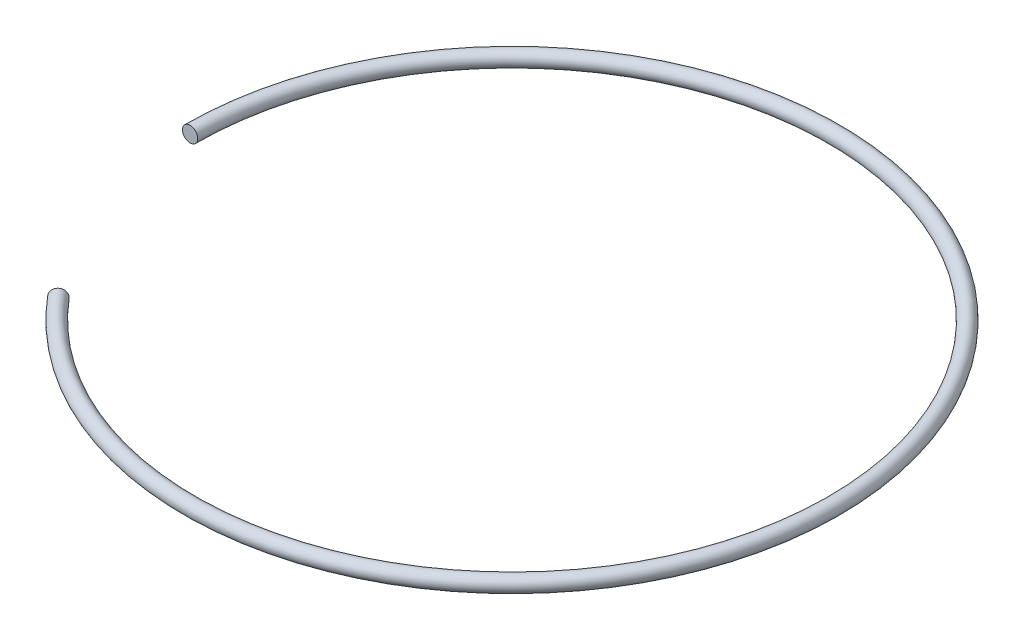
ISO-10303-21;
HEADER;
FILE_DESCRIPTION(('STEP AP214'),'2;1');
FILE_NAME('part.step','',(''),(''),'','','');
FILE_SCHEMA(('AUTOMOTIVE_DESIGN { 1 0 10303 214 1 1 1 1 }'));
ENDSEC;
DATA;
#1=APPLICATION_CONTEXT('core data for automotive mechanical design processes');
#2=APPLICATION_PROTOCOL_DEFINITION('international standard','automotive_design',2000,#1);
#3=PRODUCT_CONTEXT('',#1,'mechanical');
#4=PRODUCT('Part','Part','',(#3));
#5=PRODUCT_RELATED_PRODUCT_CATEGORY('part','',(#4));
#6=PRODUCT_DEFINITION_FORMATION('','',#4);
#7=PRODUCT_DEFINITION_CONTEXT('part definition',#1,'design');
#8=PRODUCT_DEFINITION('design','',#6,#7);
#9=PRODUCT_DEFINITION_SHAPE('','',#8);
#10=(LENGTH_UNIT() NAMED_UNIT(*) SI_UNIT(.MILLI.,.METRE.));
#11=(NAMED_UNIT(*) PLANE_ANGLE_UNIT() SI_UNIT($,.RADIAN.));
#12=(NAMED_UNIT(*) SI_UNIT($,.STERADIAN.) SOLID_ANGLE_UNIT());
#13=UNCERTAINTY_MEASURE_WITH_UNIT(LENGTH_MEASURE(1.E-05),#10,'distance_accuracy_value','');
#14=(GEOMETRIC_REPRESENTATION_CONTEXT(3) GLOBAL_UNCERTAINTY_ASSIGNED_CONTEXT((#13)) GLOBAL_UNIT_ASSIGNED_CONTEXT((#10,
#11,#12)) REPRESENTATION_CONTEXT('',''));
#15=CARTESIAN_POINT('',(0.,0.,0.));
#16=DIRECTION('',(0.,0.,1.));
#17=DIRECTION('',(1.,0.,0.));
#18=AXIS2_PLACEMENT_3D('',#15,#16,#17);
#19=CARTESIAN_POINT('',(0.,5.,0.));
#20=DIRECTION('',(0.,0.,1.));
#21=DIRECTION('',(1.,0.,0.));
#22=AXIS2_PLACEMENT_3D('',#19,#20,#21);
#23=PLANE('',#22);
#24=CARTESIAN_POINT('',(-6.15,0.440000000000001,0.));
#25=CARTESIAN_POINT('',(-6.15001062983499,0.42319249164499,0.));
#26=CARTESIAN_POINT('',(-6.15287538462174,0.406281558710685,0.));
#27=CARTESIAN_POINT('',(-6.16403597751348,0.374416764003044,0.));
#28=CARTESIAN_POINT('',(-6.17233181561848,0.359462902229706,0.));
#29=CARTESIAN_POINT('',(-6.19340700512756,0.333129254032241,0.));
#30=CARTESIAN_POINT('',(-6.20618635653177,0.321749467608205,0.));
#31=CARTESIAN_POINT('',(-6.23479109373738,0.303865334950795,0.));
#32=CARTESIAN_POINT('',(-6.25061647953878,0.297360988717422,0.));
#33=CARTESIAN_POINT('',(-6.28352818642906,0.289956461444852,0.));
#34=CARTESIAN_POINT('',(-6.30061450751794,0.289056280405654,0.));
#35=CARTESIAN_POINT('',(-6.33412206349802,0.292961554634673,0.));
#36=CARTESIAN_POINT('',(-6.35054329838922,0.297767009902889,0.));
#37=CARTESIAN_POINT('',(-6.38086889279606,0.312546438693667,0.));
#38=CARTESIAN_POINT('',(-6.39477325231169,0.322520412216229,0.));
#39=CARTESIAN_POINT('',(-6.41849883134805,0.346493762829983,0.));
#40=CARTESIAN_POINT('',(-6.42832005086878,0.360493139921175,0.));
#41=CARTESIAN_POINT('',(-6.44276711566352,0.391008812850514,0.));
#42=CARTESIAN_POINT('',(-6.44739296093752,0.40752510868866,0.));
#43=CARTESIAN_POINT('',(-6.44972637429642,0.429476017085077,0.));
#44=CARTESIAN_POINT('',(-6.45000333113523,0.434732930161899,0.));
#45=CARTESIAN_POINT('',(-6.44998937016501,0.456807508355013,0.));
#46=CARTESIAN_POINT('',(-6.44712461537826,0.473718441289317,0.));
#47=CARTESIAN_POINT('',(-6.43596402248651,0.505583235996959,0.));
#48=CARTESIAN_POINT('',(-6.42766818438152,0.520537097770296,0.));
#49=CARTESIAN_POINT('',(-6.40659299487243,0.546870745967761,0.));
#50=CARTESIAN_POINT('',(-6.39381364346823,0.558250532391797,0.));
#51=CARTESIAN_POINT('',(-6.36520890626262,0.576134665049207,0.));
#52=CARTESIAN_POINT('',(-6.34938352046122,0.58263901128258,0.));
#53=CARTESIAN_POINT('',(-6.31647181357094,0.590043538555151,0.));
#54=CARTESIAN_POINT('',(-6.29938549248206,0.590943719594348,0.));
#55=CARTESIAN_POINT('',(-6.26587793650198,0.587038445365329,0.));
#56=CARTESIAN_POINT('',(-6.24945670161078,0.582232990097113,0.));
#57=CARTESIAN_POINT('',(-6.21913110720394,0.567453561306336,0.));
#58=CARTESIAN_POINT('',(-6.20522674768831,0.557479587783773,0.));
#59=CARTESIAN_POINT('',(-6.18150116865195,0.533506237170019,0.));
#60=CARTESIAN_POINT('',(-6.17167994913122,0.519506860078827,0.));
#61=CARTESIAN_POINT('',(-6.15723288433648,0.488991187149488,0.));
#62=CARTESIAN_POINT('',(-6.15260703906247,0.472474891311342,0.));
#63=CARTESIAN_POINT('',(-6.15027362570358,0.450523982914926,0.));
#64=CARTESIAN_POINT('',(-6.14999666886477,0.445267069838103,0.));
#65=CARTESIAN_POINT('',(-6.15,0.440000000000001,0.));
#66=B_SPLINE_CURVE_WITH_KNOTS('',3,(#24,#25,#26,#27,#28,#29,#30,#31,#32,#33,#34,#35,#36,#37,#38,
#39,#40,#41,#42,#43,#44,#45,#46,#47,#48,#49,#50,#51,#52,#53,#54,#55,#56,#57,#58,#59,#60,#61,#62,
#63,#64,#65),.UNSPECIFIED.,.T.,.F.,(4,2,2,2,2,2,2,2,2,2,2,2,2,2,2,2,2,2,2,2,4),(0.,
0.0503657057955508,0.100731411591102,0.151097117387924,0.201462823184745,0.251828528981568,
0.302194234778389,0.35255994057521,0.402925646372032,0.453291352168854,0.469074755887429,
0.519440461682979,0.56980616747853,0.620171873275351,0.670537579072173,0.720903284868995,
0.771268990665817,0.821634696462639,0.872000402259462,0.922366108056283,0.938149511774858),.UNSPECIFIED.);
#67=CARTESIAN_POINT('',(-6.15,0.440000000000001,0.));
#68=VERTEX_POINT('',#67);
#69=EDGE_CURVE('E19',#68,#68,#66,.T.);
#70=ORIENTED_EDGE('',*,*,#69,.F.);
#71=EDGE_LOOP('',(#70));
#72=FACE_BOUND('',#71,.T.);
#73=ADVANCED_FACE('F15',(#72),#23,.T.);
#74=CARTESIAN_POINT('',(0.,5.,0.));
#75=DIRECTION('',(0.64278760968653,0.,0.766044443118986));
#76=DIRECTION('',(0.766044443118986,0.,-0.64278760968653));
#77=AXIS2_PLACEMENT_3D('',#74,#75,#76);
#78=PLANE('',#77);
#79=CARTESIAN_POINT('',(-4.94098665811746,0.440000000000001,4.14598008247812));
#80=CARTESIAN_POINT('',(-4.94097851519143,0.42319249164499,4.14597324975189));
#81=CARTESIAN_POINT('',(-4.93878398570615,0.406281558710686,4.14413182087018));
#82=CARTESIAN_POINT('',(-4.93023447553951,0.374416764003044,4.13695793004261));
#83=CARTESIAN_POINT('',(-4.92387949485816,0.359462902229706,4.13162546809675));
#84=CARTESIAN_POINT('',(-4.90773496304705,0.333129254032242,4.11807859740852));
#85=CARTESIAN_POINT('',(-4.8979454119172,0.321749467608205,4.10986418866607));
#86=CARTESIAN_POINT('',(-4.87603291193396,0.303865334950796,4.09147741801196));
#87=CARTESIAN_POINT('',(-4.86390996308058,0.297360988717422,4.08130505610031));
#88=CARTESIAN_POINT('',(-4.83869813290372,0.289956461444852,4.0601498186976));
#89=CARTESIAN_POINT('',(-4.82560925158024,0.289056280405654,4.04916694320655));
#90=CARTESIAN_POINT('',(-4.7999409745192,0.292961554634673,4.02762870139168));
#91=CARTESIAN_POINT('',(-4.78736157878164,0.297767009902889,4.01707333506786));
#92=CARTESIAN_POINT('',(-4.764130825702,0.312546438693667,3.99758041872676));
#93=CARTESIAN_POINT('',(-4.75347946835992,0.322520412216229,3.98864286870949));
#94=CARTESIAN_POINT('',(-4.73530462037934,0.346493762829983,3.97339236047228));
#95=CARTESIAN_POINT('',(-4.72778112974084,0.360493139921176,3.96707940225234));
#96=CARTESIAN_POINT('',(-4.71671403603545,0.391008812850514,3.95779300800594));
#97=CARTESIAN_POINT('',(-4.71317043296857,0.40752510868866,3.95481957197949));
#98=CARTESIAN_POINT('',(-4.71138293463148,0.429476017085076,3.95331968278411));
#99=CARTESIAN_POINT('',(-4.71117077338413,0.434732930161899,3.9531416583597));
#100=CARTESIAN_POINT('',(-4.71118146810779,0.456807508355013,3.95315063229838));
#101=CARTESIAN_POINT('',(-4.71337599759308,0.473718441289317,3.9549920611801));
#102=CARTESIAN_POINT('',(-4.72192550775971,0.505583235996959,3.96216595200767));
#103=CARTESIAN_POINT('',(-4.72828048844106,0.520537097770296,3.96749841395352));
#104=CARTESIAN_POINT('',(-4.74442502025217,0.546870745967761,3.98104528464176));
#105=CARTESIAN_POINT('',(-4.75421457138202,0.558250532391797,3.98925969338421));
#106=CARTESIAN_POINT('',(-4.77612707136526,0.576134665049207,4.00764646403831));
#107=CARTESIAN_POINT('',(-4.78825002021864,0.582639011282581,4.01781882594997));
#108=CARTESIAN_POINT('',(-4.8134618503955,0.590043538555151,4.03897406335267));
#109=CARTESIAN_POINT('',(-4.82655073171898,0.590943719594348,4.04995693884373));
#110=CARTESIAN_POINT('',(-4.85221900878002,0.587038445365329,4.0714951806586));
#111=CARTESIAN_POINT('',(-4.86479840451758,0.582232990097113,4.08205054698242));
#112=CARTESIAN_POINT('',(-4.88802915759722,0.567453561306335,4.10154346332352));
#113=CARTESIAN_POINT('',(-4.8986805149393,0.557479587783773,4.11048101334079));
#114=CARTESIAN_POINT('',(-4.91685536291988,0.533506237170019,4.125731521578));
#115=CARTESIAN_POINT('',(-4.92437885355839,0.519506860078827,4.13204447979794));
#116=CARTESIAN_POINT('',(-4.93544594726378,0.488991187149488,4.14133087404433));
#117=CARTESIAN_POINT('',(-4.93898955033066,0.472474891311342,4.14430431007079));
#118=CARTESIAN_POINT('',(-4.94077704866774,0.450523982914926,4.14580419926617));
#119=CARTESIAN_POINT('',(-4.94098920991509,0.445267069838103,4.14598222369057));
#120=CARTESIAN_POINT('',(-4.94098665811746,0.440000000000001,4.14598008247812));
#121=B_SPLINE_CURVE_WITH_KNOTS('',3,(#79,#80,#81,#82,#83,#84,#85,#86,#87,#88,#89,#90,#91,#92,
#93,#94,#95,#96,#97,#98,#99,#100,#101,#102,#103,#104,#105,#106,#107,#108,#109,#110,#111,#112,
#113,#114,#115,#116,#117,#118,#119,#120),.UNSPECIFIED.,.T.,.F.,(4,2,2,2,2,2,2,2,2,2,2,2,2,2,2,2,
2,2,2,2,4),(0.,0.0503657057955507,0.100731411591101,0.151097117387922,0.201462823184744,
0.251828528981568,0.302194234778388,0.352559940575211,0.402925646372032,0.453291352168854,
0.469074755887429,0.51944046168298,0.56980616747853,0.620171873275353,0.670537579072175,
0.720903284868996,0.771268990665818,0.821634696462639,0.872000402259461,0.922366108056283,
0.938149511774858),.UNSPECIFIED.);
#122=CARTESIAN_POINT('',(-4.94098665811746,0.440000000000001,4.14598008247812));
#123=VERTEX_POINT('',#122);
#124=EDGE_CURVE('E10',#123,#123,#121,.T.);
#125=ORIENTED_EDGE('',*,*,#124,.F.);
#126=EDGE_LOOP('',(#125));
#127=FACE_BOUND('',#126,.T.);
#128=ADVANCED_FACE('F35',(#127),#78,.F.);
#129=CARTESIAN_POINT('',(0.,0.440000000000001,0.));
#130=DIRECTION('',(0.,-1.,0.));
#131=DIRECTION('',(0.,0.,1.));
#132=AXIS2_PLACEMENT_3D('',#129,#130,#131);
#133=TOROIDAL_SURFACE('',#132,6.3,0.150000000000001);
#134=ORIENTED_EDGE('',*,*,#124,.T.);
#135=EDGE_LOOP('',(#134));
#136=FACE_BOUND('',#135,.T.);
#137=ORIENTED_EDGE('',*,*,#69,.T.);
#138=EDGE_LOOP('',(#137));
#139=FACE_BOUND('',#138,.T.);
#140=ADVANCED_FACE('F37',(#136,#139),#133,.T.);
#141=CLOSED_SHELL('',(#73,#128,#140));
#142=MANIFOLD_SOLID_BREP('B1',#141);
#143=ADVANCED_BREP_SHAPE_REPRESENTATION('',(#18,#142),#14);
#144=SHAPE_DEFINITION_REPRESENTATION(#9,#143);
ENDSEC;
END-ISO-10303-21;
